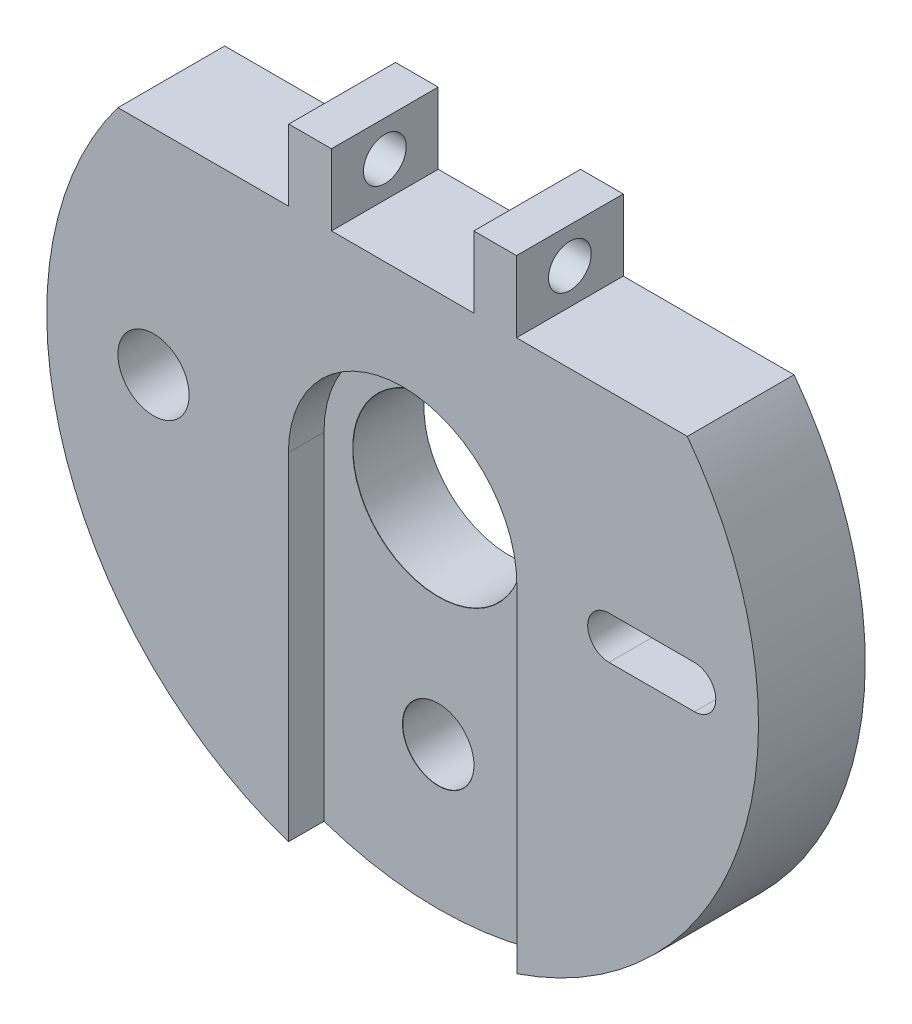
ISO-10303-21;
HEADER;
FILE_DESCRIPTION(('STEP AP214'),'2;1');
FILE_NAME('part.step','',(''),(''),'','','');
FILE_SCHEMA(('AUTOMOTIVE_DESIGN { 1 0 10303 214 1 1 1 1 }'));
ENDSEC;
DATA;
#1=APPLICATION_CONTEXT('core data for automotive mechanical design processes');
#2=APPLICATION_PROTOCOL_DEFINITION('international standard','automotive_design',2000,#1);
#3=PRODUCT_CONTEXT('',#1,'mechanical');
#4=PRODUCT('Part','Part','',(#3));
#5=PRODUCT_RELATED_PRODUCT_CATEGORY('part','',(#4));
#6=PRODUCT_DEFINITION_FORMATION('','',#4);
#7=PRODUCT_DEFINITION_CONTEXT('part definition',#1,'design');
#8=PRODUCT_DEFINITION('design','',#6,#7);
#9=PRODUCT_DEFINITION_SHAPE('','',#8);
#10=(LENGTH_UNIT() NAMED_UNIT(*) SI_UNIT(.MILLI.,.METRE.));
#11=(NAMED_UNIT(*) PLANE_ANGLE_UNIT() SI_UNIT($,.RADIAN.));
#12=(NAMED_UNIT(*) SI_UNIT($,.STERADIAN.) SOLID_ANGLE_UNIT());
#13=UNCERTAINTY_MEASURE_WITH_UNIT(LENGTH_MEASURE(1.E-05),#10,'distance_accuracy_value','');
#14=(GEOMETRIC_REPRESENTATION_CONTEXT(3) GLOBAL_UNCERTAINTY_ASSIGNED_CONTEXT((#13)) GLOBAL_UNIT_ASSIGNED_CONTEXT((#10,
#11,#12)) REPRESENTATION_CONTEXT('',''));
#15=CARTESIAN_POINT('',(0.,0.,0.));
#16=DIRECTION('',(0.,0.,1.));
#17=DIRECTION('',(1.,0.,0.));
#18=AXIS2_PLACEMENT_3D('',#15,#16,#17);
#19=CARTESIAN_POINT('',(-40.,30.,15.));
#20=DIRECTION('',(0.,1.,0.));
#21=DIRECTION('',(0.,0.,1.));
#22=AXIS2_PLACEMENT_3D('',#19,#20,#21);
#23=PLANE('',#22);
#24=DIRECTION('',(1.,0.,0.));
#25=VECTOR('',#24,1.);
#26=CARTESIAN_POINT('',(-40.,30.,0.));
#27=LINE('',#26,#25);
#28=CARTESIAN_POINT('',(-40.,30.,0.));
#29=VERTEX_POINT('',#28);
#30=CARTESIAN_POINT('',(-16.,30.,0.));
#31=VERTEX_POINT('',#30);
#32=EDGE_CURVE('E247',#29,#31,#27,.T.);
#33=ORIENTED_EDGE('',*,*,#32,.F.);
#34=DIRECTION('',(0.,0.,-1.));
#35=VECTOR('',#34,1.);
#36=CARTESIAN_POINT('',(-40.,30.,15.));
#37=LINE('',#36,#35);
#38=CARTESIAN_POINT('',(-40.,30.,15.));
#39=VERTEX_POINT('',#38);
#40=EDGE_CURVE('E321',#39,#29,#37,.T.);
#41=ORIENTED_EDGE('',*,*,#40,.F.);
#42=DIRECTION('',(1.,0.,0.));
#43=VECTOR('',#42,1.);
#44=CARTESIAN_POINT('',(-40.,30.,15.));
#45=LINE('',#44,#43);
#46=CARTESIAN_POINT('',(-16.,30.,15.));
#47=VERTEX_POINT('',#46);
#48=EDGE_CURVE('E248',#39,#47,#45,.T.);
#49=ORIENTED_EDGE('',*,*,#48,.T.);
#50=DIRECTION('',(0.,0.,-1.));
#51=VECTOR('',#50,1.);
#52=CARTESIAN_POINT('',(-16.,30.,15.));
#53=LINE('',#52,#51);
#54=EDGE_CURVE('E286',#47,#31,#53,.T.);
#55=ORIENTED_EDGE('',*,*,#54,.T.);
#56=EDGE_LOOP('',(#33,#41,#49,#55));
#57=FACE_BOUND('',#56,.T.);
#58=ADVANCED_FACE('F43',(#57),#23,.T.);
#59=CARTESIAN_POINT('',(0.,0.,15.));
#60=DIRECTION('',(0.,0.,-1.));
#61=DIRECTION('',(-1.,0.,0.));
#62=AXIS2_PLACEMENT_3D('',#59,#60,#61);
#63=CYLINDRICAL_SURFACE('',#62,50.);
#64=CARTESIAN_POINT('',(0.,0.,15.));
#65=DIRECTION('',(0.,0.,1.));
#66=DIRECTION('',(1.,0.,0.));
#67=AXIS2_PLACEMENT_3D('',#64,#65,#66);
#68=CIRCLE('',#67,50.);
#69=CARTESIAN_POINT('',(16.05,-47.3539597077161,15.));
#70=VERTEX_POINT('',#69);
#71=CARTESIAN_POINT('',(40.,30.,15.));
#72=VERTEX_POINT('',#71);
#73=EDGE_CURVE('E281',#70,#72,#68,.T.);
#74=ORIENTED_EDGE('',*,*,#73,.F.);
#75=DIRECTION('',(0.,0.,-1.));
#76=VECTOR('',#75,1.);
#77=CARTESIAN_POINT('',(16.05,-47.3539597077161,15.));
#78=LINE('',#77,#76);
#79=CARTESIAN_POINT('',(16.05,-47.3539597077161,10.));
#80=VERTEX_POINT('',#79);
#81=EDGE_CURVE('E243',#70,#80,#78,.T.);
#82=ORIENTED_EDGE('',*,*,#81,.T.);
#83=CARTESIAN_POINT('',(0.,0.,10.));
#84=DIRECTION('',(0.,0.,1.));
#85=DIRECTION('',(1.,0.,0.));
#86=AXIS2_PLACEMENT_3D('',#83,#84,#85);
#87=CIRCLE('',#86,50.);
#88=CARTESIAN_POINT('',(-16.05,-47.3539597077161,10.));
#89=VERTEX_POINT('',#88);
#90=EDGE_CURVE('E11',#89,#80,#87,.T.);
#91=ORIENTED_EDGE('',*,*,#90,.F.);
#92=DIRECTION('',(0.,0.,-1.));
#93=VECTOR('',#92,1.);
#94=CARTESIAN_POINT('',(-16.05,-47.3539597077161,15.));
#95=LINE('',#94,#93);
#96=CARTESIAN_POINT('',(-16.05,-47.3539597077161,15.));
#97=VERTEX_POINT('',#96);
#98=EDGE_CURVE('E236',#89,#97,#95,.F.);
#99=ORIENTED_EDGE('',*,*,#98,.T.);
#100=EDGE_CURVE('E282',#39,#97,#68,.T.);
#101=ORIENTED_EDGE('',*,*,#100,.F.);
#102=ORIENTED_EDGE('',*,*,#40,.T.);
#103=CARTESIAN_POINT('',(0.,0.,0.));
#104=DIRECTION('',(0.,0.,1.));
#105=DIRECTION('',(1.,0.,0.));
#106=AXIS2_PLACEMENT_3D('',#103,#104,#105);
#107=CIRCLE('',#106,50.);
#108=CARTESIAN_POINT('',(40.,30.,0.));
#109=VERTEX_POINT('',#108);
#110=EDGE_CURVE('E253',#29,#109,#107,.T.);
#111=ORIENTED_EDGE('',*,*,#110,.T.);
#112=DIRECTION('',(0.,0.,-1.));
#113=VECTOR('',#112,1.);
#114=CARTESIAN_POINT('',(40.,30.,15.));
#115=LINE('',#114,#113);
#116=EDGE_CURVE('E324',#72,#109,#115,.T.);
#117=ORIENTED_EDGE('',*,*,#116,.F.);
#118=EDGE_LOOP('',(#74,#82,#91,#99,#101,#102,#111,#117));
#119=FACE_BOUND('',#118,.T.);
#120=ADVANCED_FACE('F374',(#119),#63,.T.);
#121=CARTESIAN_POINT('',(40.,30.,15.));
#122=DIRECTION('',(0.,-1.,0.));
#123=DIRECTION('',(0.,0.,-1.));
#124=AXIS2_PLACEMENT_3D('',#121,#122,#123);
#125=PLANE('',#124);
#126=DIRECTION('',(-1.,0.,0.));
#127=VECTOR('',#126,1.);
#128=CARTESIAN_POINT('',(40.,30.,0.));
#129=LINE('',#128,#127);
#130=CARTESIAN_POINT('',(16.,30.,0.));
#131=VERTEX_POINT('',#130);
#132=EDGE_CURVE('E316',#109,#131,#129,.T.);
#133=ORIENTED_EDGE('',*,*,#132,.T.);
#134=DIRECTION('',(0.,0.,-1.));
#135=VECTOR('',#134,1.);
#136=CARTESIAN_POINT('',(16.,30.,15.));
#137=LINE('',#136,#135);
#138=CARTESIAN_POINT('',(16.,30.,15.));
#139=VERTEX_POINT('',#138);
#140=EDGE_CURVE('E328',#139,#131,#137,.T.);
#141=ORIENTED_EDGE('',*,*,#140,.F.);
#142=DIRECTION('',(-1.,0.,0.));
#143=VECTOR('',#142,1.);
#144=CARTESIAN_POINT('',(40.,30.,15.));
#145=LINE('',#144,#143);
#146=EDGE_CURVE('E278',#72,#139,#145,.T.);
#147=ORIENTED_EDGE('',*,*,#146,.F.);
#148=ORIENTED_EDGE('',*,*,#116,.T.);
#149=EDGE_LOOP('',(#133,#141,#147,#148));
#150=FACE_BOUND('',#149,.T.);
#151=ADVANCED_FACE('F395',(#150),#125,.F.);
#152=CARTESIAN_POINT('',(16.,30.,15.));
#153=DIRECTION('',(-1.,0.,0.));
#154=DIRECTION('',(0.,0.,1.));
#155=AXIS2_PLACEMENT_3D('',#152,#153,#154);
#156=PLANE('',#155);
#157=CARTESIAN_POINT('',(16.,35.,7.5));
#158=DIRECTION('',(-1.,0.,0.));
#159=DIRECTION('',(0.,0.,1.));
#160=AXIS2_PLACEMENT_3D('',#157,#158,#159);
#161=CIRCLE('',#160,3.);
#162=CARTESIAN_POINT('',(16.,35.,10.5));
#163=VERTEX_POINT('',#162);
#164=EDGE_CURVE('E739',#163,#163,#161,.T.);
#165=ORIENTED_EDGE('',*,*,#164,.T.);
#166=EDGE_LOOP('',(#165));
#167=FACE_BOUND('',#166,.T.);
#168=DIRECTION('',(0.,1.,0.));
#169=VECTOR('',#168,1.);
#170=CARTESIAN_POINT('',(16.,30.,0.));
#171=LINE('',#170,#169);
#172=CARTESIAN_POINT('',(16.,40.,0.));
#173=VERTEX_POINT('',#172);
#174=EDGE_CURVE('E313',#131,#173,#171,.T.);
#175=ORIENTED_EDGE('',*,*,#174,.T.);
#176=DIRECTION('',(0.,0.,-1.));
#177=VECTOR('',#176,1.);
#178=CARTESIAN_POINT('',(16.,40.,15.));
#179=LINE('',#178,#177);
#180=CARTESIAN_POINT('',(16.,40.,15.));
#181=VERTEX_POINT('',#180);
#182=EDGE_CURVE('E332',#181,#173,#179,.T.);
#183=ORIENTED_EDGE('',*,*,#182,.F.);
#184=DIRECTION('',(0.,1.,0.));
#185=VECTOR('',#184,1.);
#186=CARTESIAN_POINT('',(16.,30.,15.));
#187=LINE('',#186,#185);
#188=EDGE_CURVE('E275',#139,#181,#187,.T.);
#189=ORIENTED_EDGE('',*,*,#188,.F.);
#190=ORIENTED_EDGE('',*,*,#140,.T.);
#191=EDGE_LOOP('',(#175,#183,#189,#190));
#192=FACE_BOUND('',#191,.T.);
#193=ADVANCED_FACE('F412',(#167,#192),#156,.F.);
#194=CARTESIAN_POINT('',(16.,40.,15.));
#195=DIRECTION('',(0.,-1.,0.));
#196=DIRECTION('',(0.,0.,-1.));
#197=AXIS2_PLACEMENT_3D('',#194,#195,#196);
#198=PLANE('',#197);
#199=DIRECTION('',(-1.,0.,0.));
#200=VECTOR('',#199,1.);
#201=CARTESIAN_POINT('',(16.,40.,0.));
#202=LINE('',#201,#200);
#203=CARTESIAN_POINT('',(9.99999999999999,40.,0.));
#204=VERTEX_POINT('',#203);
#205=EDGE_CURVE('E310',#173,#204,#202,.T.);
#206=ORIENTED_EDGE('',*,*,#205,.T.);
#207=DIRECTION('',(0.,0.,-1.));
#208=VECTOR('',#207,1.);
#209=CARTESIAN_POINT('',(9.99999999999999,40.,15.));
#210=LINE('',#209,#208);
#211=CARTESIAN_POINT('',(9.99999999999999,40.,15.));
#212=VERTEX_POINT('',#211);
#213=EDGE_CURVE('E336',#212,#204,#210,.T.);
#214=ORIENTED_EDGE('',*,*,#213,.F.);
#215=DIRECTION('',(-1.,0.,0.));
#216=VECTOR('',#215,1.);
#217=CARTESIAN_POINT('',(16.,40.,15.));
#218=LINE('',#217,#216);
#219=EDGE_CURVE('E272',#181,#212,#218,.T.);
#220=ORIENTED_EDGE('',*,*,#219,.F.);
#221=ORIENTED_EDGE('',*,*,#182,.T.);
#222=EDGE_LOOP('',(#206,#214,#220,#221));
#223=FACE_BOUND('',#222,.T.);
#224=ADVANCED_FACE('F415',(#223),#198,.F.);
#225=CARTESIAN_POINT('',(9.99999999999999,40.,15.));
#226=DIRECTION('',(1.,0.,0.));
#227=DIRECTION('',(0.,1.,0.));
#228=AXIS2_PLACEMENT_3D('',#225,#226,#227);
#229=PLANE('',#228);
#230=CARTESIAN_POINT('',(10.,35.,7.5));
#231=DIRECTION('',(1.,0.,0.));
#232=DIRECTION('',(0.,1.,0.));
#233=AXIS2_PLACEMENT_3D('',#230,#231,#232);
#234=CIRCLE('',#233,3.);
#235=CARTESIAN_POINT('',(10.,38.,7.5));
#236=VERTEX_POINT('',#235);
#237=EDGE_CURVE('E742',#236,#236,#234,.T.);
#238=ORIENTED_EDGE('',*,*,#237,.T.);
#239=EDGE_LOOP('',(#238));
#240=FACE_BOUND('',#239,.T.);
#241=DIRECTION('',(0.,-1.,0.));
#242=VECTOR('',#241,1.);
#243=CARTESIAN_POINT('',(9.99999999999999,40.,0.));
#244=LINE('',#243,#242);
#245=CARTESIAN_POINT('',(10.,30.,0.));
#246=VERTEX_POINT('',#245);
#247=EDGE_CURVE('E306',#204,#246,#244,.T.);
#248=ORIENTED_EDGE('',*,*,#247,.T.);
#249=DIRECTION('',(0.,0.,-1.));
#250=VECTOR('',#249,1.);
#251=CARTESIAN_POINT('',(10.,30.,15.));
#252=LINE('',#251,#250);
#253=CARTESIAN_POINT('',(10.,30.,15.));
#254=VERTEX_POINT('',#253);
#255=EDGE_CURVE('E340',#254,#246,#252,.T.);
#256=ORIENTED_EDGE('',*,*,#255,.F.);
#257=DIRECTION('',(0.,-1.,0.));
#258=VECTOR('',#257,1.);
#259=CARTESIAN_POINT('',(9.99999999999999,40.,15.));
#260=LINE('',#259,#258);
#261=EDGE_CURVE('E269',#212,#254,#260,.T.);
#262=ORIENTED_EDGE('',*,*,#261,.F.);
#263=ORIENTED_EDGE('',*,*,#213,.T.);
#264=EDGE_LOOP('',(#248,#256,#262,#263));
#265=FACE_BOUND('',#264,.T.);
#266=ADVANCED_FACE('F420',(#240,#265),#229,.F.);
#267=CARTESIAN_POINT('',(-9.99999999999999,30.,15.));
#268=DIRECTION('',(0.,1.,0.));
#269=DIRECTION('',(-1.,0.,0.));
#270=AXIS2_PLACEMENT_3D('',#267,#268,#269);
#271=PLANE('',#270);
#272=DIRECTION('',(1.,0.,0.));
#273=VECTOR('',#272,1.);
#274=CARTESIAN_POINT('',(-9.99999999999999,30.,0.));
#275=LINE('',#274,#273);
#276=CARTESIAN_POINT('',(-9.99999999999999,30.,0.));
#277=VERTEX_POINT('',#276);
#278=EDGE_CURVE('E302',#277,#246,#275,.T.);
#279=ORIENTED_EDGE('',*,*,#278,.F.);
#280=DIRECTION('',(0.,0.,-1.));
#281=VECTOR('',#280,1.);
#282=CARTESIAN_POINT('',(-9.99999999999999,30.,15.));
#283=LINE('',#282,#281);
#284=CARTESIAN_POINT('',(-9.99999999999999,30.,15.));
#285=VERTEX_POINT('',#284);
#286=EDGE_CURVE('E343',#285,#277,#283,.T.);
#287=ORIENTED_EDGE('',*,*,#286,.F.);
#288=DIRECTION('',(1.,0.,0.));
#289=VECTOR('',#288,1.);
#290=CARTESIAN_POINT('',(-9.99999999999999,30.,15.));
#291=LINE('',#290,#289);
#292=EDGE_CURVE('E265',#285,#254,#291,.T.);
#293=ORIENTED_EDGE('',*,*,#292,.T.);
#294=ORIENTED_EDGE('',*,*,#255,.T.);
#295=EDGE_LOOP('',(#279,#287,#293,#294));
#296=FACE_BOUND('',#295,.T.);
#297=ADVANCED_FACE('F448',(#296),#271,.T.);
#298=CARTESIAN_POINT('',(-9.99999999999999,40.,15.));
#299=DIRECTION('',(1.,0.,0.));
#300=DIRECTION('',(0.,1.,0.));
#301=AXIS2_PLACEMENT_3D('',#298,#299,#300);
#302=PLANE('',#301);
#303=CARTESIAN_POINT('',(-9.99999999999999,35.,7.5));
#304=DIRECTION('',(1.,0.,0.));
#305=DIRECTION('',(0.,1.,0.));
#306=AXIS2_PLACEMENT_3D('',#303,#304,#305);
#307=CIRCLE('',#306,3.);
#308=CARTESIAN_POINT('',(-9.99999999999999,38.,7.5));
#309=VERTEX_POINT('',#308);
#310=EDGE_CURVE('E745',#309,#309,#307,.T.);
#311=ORIENTED_EDGE('',*,*,#310,.F.);
#312=EDGE_LOOP('',(#311));
#313=FACE_BOUND('',#312,.T.);
#314=DIRECTION('',(0.,-1.,0.));
#315=VECTOR('',#314,1.);
#316=CARTESIAN_POINT('',(-9.99999999999999,40.,0.));
#317=LINE('',#316,#315);
#318=CARTESIAN_POINT('',(-9.99999999999999,40.,0.));
#319=VERTEX_POINT('',#318);
#320=EDGE_CURVE('E298',#319,#277,#317,.T.);
#321=ORIENTED_EDGE('',*,*,#320,.F.);
#322=DIRECTION('',(0.,0.,-1.));
#323=VECTOR('',#322,1.);
#324=CARTESIAN_POINT('',(-9.99999999999999,40.,15.));
#325=LINE('',#324,#323);
#326=CARTESIAN_POINT('',(-9.99999999999999,40.,15.));
#327=VERTEX_POINT('',#326);
#328=EDGE_CURVE('E346',#327,#319,#325,.T.);
#329=ORIENTED_EDGE('',*,*,#328,.F.);
#330=DIRECTION('',(0.,-1.,0.));
#331=VECTOR('',#330,1.);
#332=CARTESIAN_POINT('',(-9.99999999999999,40.,15.));
#333=LINE('',#332,#331);
#334=EDGE_CURVE('E261',#327,#285,#333,.T.);
#335=ORIENTED_EDGE('',*,*,#334,.T.);
#336=ORIENTED_EDGE('',*,*,#286,.T.);
#337=EDGE_LOOP('',(#321,#329,#335,#336));
#338=FACE_BOUND('',#337,.T.);
#339=ADVANCED_FACE('F427',(#313,#338),#302,.T.);
#340=CARTESIAN_POINT('',(-16.,40.,15.));
#341=DIRECTION('',(0.,1.,0.));
#342=DIRECTION('',(0.,0.,1.));
#343=AXIS2_PLACEMENT_3D('',#340,#341,#342);
#344=PLANE('',#343);
#345=DIRECTION('',(1.,0.,0.));
#346=VECTOR('',#345,1.);
#347=CARTESIAN_POINT('',(-16.,40.,0.));
#348=LINE('',#347,#346);
#349=CARTESIAN_POINT('',(-16.,40.,0.));
#350=VERTEX_POINT('',#349);
#351=EDGE_CURVE('E294',#350,#319,#348,.T.);
#352=ORIENTED_EDGE('',*,*,#351,.F.);
#353=DIRECTION('',(0.,0.,-1.));
#354=VECTOR('',#353,1.);
#355=CARTESIAN_POINT('',(-16.,40.,15.));
#356=LINE('',#355,#354);
#357=CARTESIAN_POINT('',(-16.,40.,15.));
#358=VERTEX_POINT('',#357);
#359=EDGE_CURVE('E349',#358,#350,#356,.T.);
#360=ORIENTED_EDGE('',*,*,#359,.F.);
#361=DIRECTION('',(1.,0.,0.));
#362=VECTOR('',#361,1.);
#363=CARTESIAN_POINT('',(-16.,40.,15.));
#364=LINE('',#363,#362);
#365=EDGE_CURVE('E257',#358,#327,#364,.T.);
#366=ORIENTED_EDGE('',*,*,#365,.T.);
#367=ORIENTED_EDGE('',*,*,#328,.T.);
#368=EDGE_LOOP('',(#352,#360,#366,#367));
#369=FACE_BOUND('',#368,.T.);
#370=ADVANCED_FACE('F431',(#369),#344,.T.);
#371=CARTESIAN_POINT('',(-16.,30.,15.));
#372=DIRECTION('',(-1.,0.,0.));
#373=DIRECTION('',(0.,0.,1.));
#374=AXIS2_PLACEMENT_3D('',#371,#372,#373);
#375=PLANE('',#374);
#376=CARTESIAN_POINT('',(-16.,35.,7.5));
#377=DIRECTION('',(-1.,0.,0.));
#378=DIRECTION('',(0.,0.,1.));
#379=AXIS2_PLACEMENT_3D('',#376,#377,#378);
#380=CIRCLE('',#379,3.);
#381=CARTESIAN_POINT('',(-16.,35.,10.5));
#382=VERTEX_POINT('',#381);
#383=EDGE_CURVE('E814',#382,#382,#380,.T.);
#384=ORIENTED_EDGE('',*,*,#383,.F.);
#385=EDGE_LOOP('',(#384));
#386=FACE_BOUND('',#385,.T.);
#387=DIRECTION('',(0.,1.,0.));
#388=VECTOR('',#387,1.);
#389=CARTESIAN_POINT('',(-16.,30.,0.));
#390=LINE('',#389,#388);
#391=EDGE_CURVE('E290',#31,#350,#390,.T.);
#392=ORIENTED_EDGE('',*,*,#391,.F.);
#393=ORIENTED_EDGE('',*,*,#54,.F.);
#394=DIRECTION('',(0.,1.,0.));
#395=VECTOR('',#394,1.);
#396=CARTESIAN_POINT('',(-16.,30.,15.));
#397=LINE('',#396,#395);
#398=EDGE_CURVE('E252',#47,#358,#397,.T.);
#399=ORIENTED_EDGE('',*,*,#398,.T.);
#400=ORIENTED_EDGE('',*,*,#359,.T.);
#401=EDGE_LOOP('',(#392,#393,#399,#400));
#402=FACE_BOUND('',#401,.T.);
#403=ADVANCED_FACE('F434',(#386,#402),#375,.T.);
#404=CARTESIAN_POINT('',(0.,0.,15.));
#405=DIRECTION('',(0.,0.,1.));
#406=DIRECTION('',(1.,0.,0.));
#407=AXIS2_PLACEMENT_3D('',#404,#405,#406);
#408=PLANE('',#407);
#409=CARTESIAN_POINT('',(-35.,0.,15.));
#410=DIRECTION('',(0.,0.,1.));
#411=DIRECTION('',(1.,0.,0.));
#412=AXIS2_PLACEMENT_3D('',#409,#410,#411);
#413=CIRCLE('',#412,4.99999999999999);
#414=CARTESIAN_POINT('',(-30.,0.,15.));
#415=VERTEX_POINT('',#414);
#416=EDGE_CURVE('E744',#415,#415,#413,.T.);
#417=ORIENTED_EDGE('',*,*,#416,.F.);
#418=EDGE_LOOP('',(#417));
#419=FACE_BOUND('',#418,.T.);
#420=CARTESIAN_POINT('',(29.,0.,15.));
#421=DIRECTION('',(0.,0.,1.));
#422=DIRECTION('',(1.,0.,0.));
#423=AXIS2_PLACEMENT_3D('',#420,#421,#422);
#424=CIRCLE('',#423,3.);
#425=CARTESIAN_POINT('',(29.,3.,15.));
#426=VERTEX_POINT('',#425);
#427=CARTESIAN_POINT('',(29.,-3.,15.));
#428=VERTEX_POINT('',#427);
#429=EDGE_CURVE('E58',#426,#428,#424,.T.);
#430=ORIENTED_EDGE('',*,*,#429,.F.);
#431=DIRECTION('',(-1.,0.,0.));
#432=VECTOR('',#431,1.);
#433=CARTESIAN_POINT('',(29.,3.,15.));
#434=LINE('',#433,#432);
#435=CARTESIAN_POINT('',(41.,3.,15.));
#436=VERTEX_POINT('',#435);
#437=EDGE_CURVE('E176',#436,#426,#434,.T.);
#438=ORIENTED_EDGE('',*,*,#437,.F.);
#439=CARTESIAN_POINT('',(41.,0.,15.));
#440=DIRECTION('',(0.,0.,1.));
#441=DIRECTION('',(1.,0.,0.));
#442=AXIS2_PLACEMENT_3D('',#439,#440,#441);
#443=CIRCLE('',#442,3.);
#444=CARTESIAN_POINT('',(41.,-3.,15.));
#445=VERTEX_POINT('',#444);
#446=EDGE_CURVE('E201',#445,#436,#443,.T.);
#447=ORIENTED_EDGE('',*,*,#446,.F.);
#448=DIRECTION('',(1.,0.,0.));
#449=VECTOR('',#448,1.);
#450=CARTESIAN_POINT('',(29.,-3.,15.));
#451=LINE('',#450,#449);
#452=EDGE_CURVE('E194',#428,#445,#451,.T.);
#453=ORIENTED_EDGE('',*,*,#452,.F.);
#454=EDGE_LOOP('',(#430,#438,#447,#453));
#455=FACE_BOUND('',#454,.T.);
#456=DIRECTION('',(0.,1.,0.));
#457=VECTOR('',#456,1.);
#458=CARTESIAN_POINT('',(16.05,0.,15.));
#459=LINE('',#458,#457);
#460=CARTESIAN_POINT('',(16.05,0.,15.));
#461=VERTEX_POINT('',#460);
#462=EDGE_CURVE('E51',#70,#461,#459,.T.);
#463=ORIENTED_EDGE('',*,*,#462,.F.);
#464=ORIENTED_EDGE('',*,*,#73,.T.);
#465=ORIENTED_EDGE('',*,*,#146,.T.);
#466=ORIENTED_EDGE('',*,*,#188,.T.);
#467=ORIENTED_EDGE('',*,*,#219,.T.);
#468=ORIENTED_EDGE('',*,*,#261,.T.);
#469=ORIENTED_EDGE('',*,*,#292,.F.);
#470=ORIENTED_EDGE('',*,*,#334,.F.);
#471=ORIENTED_EDGE('',*,*,#365,.F.);
#472=ORIENTED_EDGE('',*,*,#398,.F.);
#473=ORIENTED_EDGE('',*,*,#48,.F.);
#474=ORIENTED_EDGE('',*,*,#100,.T.);
#475=DIRECTION('',(0.,-1.,0.));
#476=VECTOR('',#475,1.);
#477=CARTESIAN_POINT('',(-16.05,0.,15.));
#478=LINE('',#477,#476);
#479=CARTESIAN_POINT('',(-16.05,0.,15.));
#480=VERTEX_POINT('',#479);
#481=EDGE_CURVE('E220',#480,#97,#478,.T.);
#482=ORIENTED_EDGE('',*,*,#481,.F.);
#483=CARTESIAN_POINT('',(0.,0.,15.));
#484=DIRECTION('',(0.,0.,1.));
#485=DIRECTION('',(1.,0.,0.));
#486=AXIS2_PLACEMENT_3D('',#483,#484,#485);
#487=CIRCLE('',#486,16.05);
#488=EDGE_CURVE('E183',#461,#480,#487,.T.);
#489=ORIENTED_EDGE('',*,*,#488,.F.);
#490=EDGE_LOOP('',(#463,#464,#465,#466,#467,#468,#469,#470,#471,#472,#473,#474,#482,#489));
#491=FACE_BOUND('',#490,.T.);
#492=ADVANCED_FACE('F366',(#419,#455,#491),#408,.T.);
#493=CARTESIAN_POINT('',(0.,0.,0.));
#494=DIRECTION('',(0.,0.,1.));
#495=DIRECTION('',(1.,0.,0.));
#496=AXIS2_PLACEMENT_3D('',#493,#494,#495);
#497=PLANE('',#496);
#498=CARTESIAN_POINT('',(-35.,0.,0.));
#499=DIRECTION('',(0.,0.,1.));
#500=DIRECTION('',(1.,0.,0.));
#501=AXIS2_PLACEMENT_3D('',#498,#499,#500);
#502=CIRCLE('',#501,3.5);
#503=CARTESIAN_POINT('',(-31.5,0.,0.));
#504=VERTEX_POINT('',#503);
#505=EDGE_CURVE('E763',#504,#504,#502,.T.);
#506=ORIENTED_EDGE('',*,*,#505,.T.);
#507=EDGE_LOOP('',(#506));
#508=FACE_BOUND('',#507,.T.);
#509=CARTESIAN_POINT('',(0.,-30.,0.));
#510=DIRECTION('',(0.,0.,1.));
#511=DIRECTION('',(1.,0.,0.));
#512=AXIS2_PLACEMENT_3D('',#509,#510,#511);
#513=CIRCLE('',#512,5.);
#514=CARTESIAN_POINT('',(5.,-30.,0.));
#515=VERTEX_POINT('',#514);
#516=EDGE_CURVE('E775',#515,#515,#513,.T.);
#517=ORIENTED_EDGE('',*,*,#516,.T.);
#518=EDGE_LOOP('',(#517));
#519=FACE_BOUND('',#518,.T.);
#520=CARTESIAN_POINT('',(0.,0.,0.));
#521=DIRECTION('',(0.,0.,1.));
#522=DIRECTION('',(1.,0.,0.));
#523=AXIS2_PLACEMENT_3D('',#520,#521,#522);
#524=CIRCLE('',#523,12.);
#525=CARTESIAN_POINT('',(12.,0.,0.));
#526=VERTEX_POINT('',#525);
#527=EDGE_CURVE('E787',#526,#526,#524,.T.);
#528=ORIENTED_EDGE('',*,*,#527,.T.);
#529=EDGE_LOOP('',(#528));
#530=FACE_BOUND('',#529,.T.);
#531=DIRECTION('',(1.,0.,0.));
#532=VECTOR('',#531,1.);
#533=CARTESIAN_POINT('',(29.,3.,0.));
#534=LINE('',#533,#532);
#535=CARTESIAN_POINT('',(29.,3.,0.));
#536=VERTEX_POINT('',#535);
#537=CARTESIAN_POINT('',(41.,3.,0.));
#538=VERTEX_POINT('',#537);
#539=EDGE_CURVE('E189',#536,#538,#534,.T.);
#540=ORIENTED_EDGE('',*,*,#539,.F.);
#541=CARTESIAN_POINT('',(29.,0.,0.));
#542=DIRECTION('',(0.,0.,1.));
#543=DIRECTION('',(1.,0.,0.));
#544=AXIS2_PLACEMENT_3D('',#541,#542,#543);
#545=CIRCLE('',#544,3.);
#546=CARTESIAN_POINT('',(29.,-3.,0.));
#547=VERTEX_POINT('',#546);
#548=EDGE_CURVE('E169',#547,#536,#545,.F.);
#549=ORIENTED_EDGE('',*,*,#548,.F.);
#550=DIRECTION('',(-1.,0.,0.));
#551=VECTOR('',#550,1.);
#552=CARTESIAN_POINT('',(29.,-3.,0.));
#553=LINE('',#552,#551);
#554=CARTESIAN_POINT('',(41.,-3.,0.));
#555=VERTEX_POINT('',#554);
#556=EDGE_CURVE('E179',#555,#547,#553,.T.);
#557=ORIENTED_EDGE('',*,*,#556,.F.);
#558=CARTESIAN_POINT('',(41.,0.,0.));
#559=DIRECTION('',(0.,0.,1.));
#560=DIRECTION('',(1.,0.,0.));
#561=AXIS2_PLACEMENT_3D('',#558,#559,#560);
#562=CIRCLE('',#561,3.);
#563=EDGE_CURVE('E66',#538,#555,#562,.F.);
#564=ORIENTED_EDGE('',*,*,#563,.F.);
#565=EDGE_LOOP('',(#540,#549,#557,#564));
#566=FACE_BOUND('',#565,.T.);
#567=ORIENTED_EDGE('',*,*,#32,.T.);
#568=ORIENTED_EDGE('',*,*,#391,.T.);
#569=ORIENTED_EDGE('',*,*,#351,.T.);
#570=ORIENTED_EDGE('',*,*,#320,.T.);
#571=ORIENTED_EDGE('',*,*,#278,.T.);
#572=ORIENTED_EDGE('',*,*,#247,.F.);
#573=ORIENTED_EDGE('',*,*,#205,.F.);
#574=ORIENTED_EDGE('',*,*,#174,.F.);
#575=ORIENTED_EDGE('',*,*,#132,.F.);
#576=ORIENTED_EDGE('',*,*,#110,.F.);
#577=EDGE_LOOP('',(#567,#568,#569,#570,#571,#572,#573,#574,#575,#576));
#578=FACE_BOUND('',#577,.T.);
#579=ADVANCED_FACE('F186',(#508,#519,#530,#566,#578),#497,.F.);
#580=CARTESIAN_POINT('',(0.,0.,10.));
#581=DIRECTION('',(0.,0.,1.));
#582=DIRECTION('',(1.,0.,0.));
#583=AXIS2_PLACEMENT_3D('',#580,#581,#582);
#584=PLANE('',#583);
#585=CARTESIAN_POINT('',(0.,-30.,10.));
#586=DIRECTION('',(0.,0.,1.));
#587=DIRECTION('',(1.,0.,0.));
#588=AXIS2_PLACEMENT_3D('',#585,#586,#587);
#589=CIRCLE('',#588,5.025);
#590=CARTESIAN_POINT('',(5.025,-30.,10.));
#591=VERTEX_POINT('',#590);
#592=EDGE_CURVE('E767',#591,#591,#589,.T.);
#593=ORIENTED_EDGE('',*,*,#592,.F.);
#594=EDGE_LOOP('',(#593));
#595=FACE_BOUND('',#594,.T.);
#596=CARTESIAN_POINT('',(0.,0.,10.));
#597=DIRECTION('',(0.,0.,1.));
#598=DIRECTION('',(1.,0.,0.));
#599=AXIS2_PLACEMENT_3D('',#596,#597,#598);
#600=CIRCLE('',#599,12.025);
#601=CARTESIAN_POINT('',(12.025,0.,10.));
#602=VERTEX_POINT('',#601);
#603=EDGE_CURVE('E779',#602,#602,#600,.T.);
#604=ORIENTED_EDGE('',*,*,#603,.F.);
#605=EDGE_LOOP('',(#604));
#606=FACE_BOUND('',#605,.T.);
#607=ORIENTED_EDGE('',*,*,#90,.T.);
#608=DIRECTION('',(0.,1.,0.));
#609=VECTOR('',#608,1.);
#610=CARTESIAN_POINT('',(16.05,0.,10.));
#611=LINE('',#610,#609);
#612=CARTESIAN_POINT('',(16.05,0.,10.));
#613=VERTEX_POINT('',#612);
#614=EDGE_CURVE('E224',#80,#613,#611,.T.);
#615=ORIENTED_EDGE('',*,*,#614,.T.);
#616=CARTESIAN_POINT('',(0.,0.,10.));
#617=DIRECTION('',(0.,0.,1.));
#618=DIRECTION('',(1.,0.,0.));
#619=AXIS2_PLACEMENT_3D('',#616,#617,#618);
#620=CIRCLE('',#619,16.05);
#621=CARTESIAN_POINT('',(-16.05,0.,10.));
#622=VERTEX_POINT('',#621);
#623=EDGE_CURVE('E215',#613,#622,#620,.T.);
#624=ORIENTED_EDGE('',*,*,#623,.T.);
#625=DIRECTION('',(0.,-1.,0.));
#626=VECTOR('',#625,1.);
#627=CARTESIAN_POINT('',(-16.05,0.,10.));
#628=LINE('',#627,#626);
#629=EDGE_CURVE('E219',#622,#89,#628,.T.);
#630=ORIENTED_EDGE('',*,*,#629,.T.);
#631=EDGE_LOOP('',(#607,#615,#624,#630));
#632=FACE_BOUND('',#631,.T.);
#633=ADVANCED_FACE('F376',(#595,#606,#632),#584,.T.);
#634=CARTESIAN_POINT('',(16.05,0.,10.));
#635=DIRECTION('',(1.,0.,0.));
#636=DIRECTION('',(0.,0.,-1.));
#637=AXIS2_PLACEMENT_3D('',#634,#635,#636);
#638=PLANE('',#637);
#639=ORIENTED_EDGE('',*,*,#462,.T.);
#640=DIRECTION('',(0.,0.,1.));
#641=VECTOR('',#640,1.);
#642=CARTESIAN_POINT('',(16.05,0.,10.));
#643=LINE('',#642,#641);
#644=EDGE_CURVE('E232',#613,#461,#643,.T.);
#645=ORIENTED_EDGE('',*,*,#644,.F.);
#646=ORIENTED_EDGE('',*,*,#614,.F.);
#647=ORIENTED_EDGE('',*,*,#81,.F.);
#648=EDGE_LOOP('',(#639,#645,#646,#647));
#649=FACE_BOUND('',#648,.T.);
#650=ADVANCED_FACE('F357',(#649),#638,.F.);
#651=CARTESIAN_POINT('',(-16.05,0.,10.));
#652=DIRECTION('',(-1.,0.,0.));
#653=DIRECTION('',(0.,-1.,0.));
#654=AXIS2_PLACEMENT_3D('',#651,#652,#653);
#655=PLANE('',#654);
#656=ORIENTED_EDGE('',*,*,#629,.F.);
#657=DIRECTION('',(0.,0.,1.));
#658=VECTOR('',#657,1.);
#659=CARTESIAN_POINT('',(-16.05,0.,10.));
#660=LINE('',#659,#658);
#661=EDGE_CURVE('E227',#622,#480,#660,.T.);
#662=ORIENTED_EDGE('',*,*,#661,.T.);
#663=ORIENTED_EDGE('',*,*,#481,.T.);
#664=ORIENTED_EDGE('',*,*,#98,.F.);
#665=EDGE_LOOP('',(#656,#662,#663,#664));
#666=FACE_BOUND('',#665,.T.);
#667=ADVANCED_FACE('F371',(#666),#655,.F.);
#668=CARTESIAN_POINT('',(0.,0.,10.));
#669=DIRECTION('',(0.,0.,1.));
#670=DIRECTION('',(1.,0.,0.));
#671=AXIS2_PLACEMENT_3D('',#668,#669,#670);
#672=CYLINDRICAL_SURFACE('',#671,16.05);
#673=ORIENTED_EDGE('',*,*,#488,.T.);
#674=ORIENTED_EDGE('',*,*,#661,.F.);
#675=ORIENTED_EDGE('',*,*,#623,.F.);
#676=ORIENTED_EDGE('',*,*,#644,.T.);
#677=EDGE_LOOP('',(#673,#674,#675,#676));
#678=FACE_BOUND('',#677,.T.);
#679=ADVANCED_FACE('F364',(#678),#672,.F.);
#680=CARTESIAN_POINT('',(29.,0.,-0.000999999999999265));
#681=DIRECTION('',(0.,0.,1.));
#682=DIRECTION('',(1.,0.,0.));
#683=AXIS2_PLACEMENT_3D('',#680,#681,#682);
#684=CYLINDRICAL_SURFACE('',#683,3.);
#685=ORIENTED_EDGE('',*,*,#548,.T.);
#686=DIRECTION('',(0.,0.,1.));
#687=VECTOR('',#686,1.);
#688=CARTESIAN_POINT('',(29.,3.,-0.000999999999999265));
#689=LINE('',#688,#687);
#690=EDGE_CURVE('E184',#536,#426,#689,.T.);
#691=ORIENTED_EDGE('',*,*,#690,.T.);
#692=ORIENTED_EDGE('',*,*,#429,.T.);
#693=DIRECTION('',(0.,0.,1.));
#694=VECTOR('',#693,1.);
#695=CARTESIAN_POINT('',(29.,-3.,-0.000999999999999265));
#696=LINE('',#695,#694);
#697=EDGE_CURVE('E165',#547,#428,#696,.T.);
#698=ORIENTED_EDGE('',*,*,#697,.F.);
#699=EDGE_LOOP('',(#685,#691,#692,#698));
#700=FACE_BOUND('',#699,.T.);
#701=ADVANCED_FACE('F167',(#700),#684,.F.);
#702=CARTESIAN_POINT('',(29.,3.,-0.000999999999999265));
#703=DIRECTION('',(0.,1.,0.));
#704=DIRECTION('',(0.,0.,1.));
#705=AXIS2_PLACEMENT_3D('',#702,#703,#704);
#706=PLANE('',#705);
#707=ORIENTED_EDGE('',*,*,#539,.T.);
#708=DIRECTION('',(0.,0.,1.));
#709=VECTOR('',#708,1.);
#710=CARTESIAN_POINT('',(41.,3.,-0.000999999999999265));
#711=LINE('',#710,#709);
#712=EDGE_CURVE('E210',#538,#436,#711,.T.);
#713=ORIENTED_EDGE('',*,*,#712,.T.);
#714=ORIENTED_EDGE('',*,*,#437,.T.);
#715=ORIENTED_EDGE('',*,*,#690,.F.);
#716=EDGE_LOOP('',(#707,#713,#714,#715));
#717=FACE_BOUND('',#716,.T.);
#718=ADVANCED_FACE('F479',(#717),#706,.F.);
#719=CARTESIAN_POINT('',(41.,0.,-0.000999999999999265));
#720=DIRECTION('',(0.,0.,1.));
#721=DIRECTION('',(1.,0.,0.));
#722=AXIS2_PLACEMENT_3D('',#719,#720,#721);
#723=CYLINDRICAL_SURFACE('',#722,3.);
#724=ORIENTED_EDGE('',*,*,#563,.T.);
#725=DIRECTION('',(0.,0.,1.));
#726=VECTOR('',#725,1.);
#727=CARTESIAN_POINT('',(41.,-3.,-0.000999999999999265));
#728=LINE('',#727,#726);
#729=EDGE_CURVE('E175',#555,#445,#728,.T.);
#730=ORIENTED_EDGE('',*,*,#729,.T.);
#731=ORIENTED_EDGE('',*,*,#446,.T.);
#732=ORIENTED_EDGE('',*,*,#712,.F.);
#733=EDGE_LOOP('',(#724,#730,#731,#732));
#734=FACE_BOUND('',#733,.T.);
#735=ADVANCED_FACE('F485',(#734),#723,.F.);
#736=CARTESIAN_POINT('',(29.,-3.,-0.000999999999999265));
#737=DIRECTION('',(0.,-1.,0.));
#738=DIRECTION('',(0.,0.,-1.));
#739=AXIS2_PLACEMENT_3D('',#736,#737,#738);
#740=PLANE('',#739);
#741=ORIENTED_EDGE('',*,*,#556,.T.);
#742=ORIENTED_EDGE('',*,*,#697,.T.);
#743=ORIENTED_EDGE('',*,*,#452,.T.);
#744=ORIENTED_EDGE('',*,*,#729,.F.);
#745=EDGE_LOOP('',(#741,#742,#743,#744));
#746=FACE_BOUND('',#745,.T.);
#747=ADVANCED_FACE('F180',(#746),#740,.F.);
#748=CARTESIAN_POINT('',(0.,0.,10.));
#749=DIRECTION('',(0.,0.,1.));
#750=DIRECTION('',(1.,0.,0.));
#751=AXIS2_PLACEMENT_3D('',#748,#749,#750);
#752=CYLINDRICAL_SURFACE('',#751,12.);
#753=ORIENTED_EDGE('',*,*,#527,.F.);
#754=EDGE_LOOP('',(#753));
#755=FACE_BOUND('',#754,.T.);
#756=CARTESIAN_POINT('',(0.,0.,9.975));
#757=DIRECTION('',(0.,0.,1.));
#758=DIRECTION('',(1.,0.,0.));
#759=AXIS2_PLACEMENT_3D('',#756,#757,#758);
#760=CIRCLE('',#759,12.);
#761=CARTESIAN_POINT('',(12.,0.,9.975));
#762=VERTEX_POINT('',#761);
#763=EDGE_CURVE('E783',#762,#762,#760,.T.);
#764=ORIENTED_EDGE('',*,*,#763,.T.);
#765=EDGE_LOOP('',(#764));
#766=FACE_BOUND('',#765,.T.);
#767=ADVANCED_FACE('F499',(#755,#766),#752,.F.);
#768=CARTESIAN_POINT('',(0.,0.,10.));
#769=DIRECTION('',(0.,0.,1.));
#770=DIRECTION('',(1.,0.,0.));
#771=AXIS2_PLACEMENT_3D('',#768,#769,#770);
#772=CONICAL_SURFACE('',#771,12.025,0.785398163397518);
#773=ORIENTED_EDGE('',*,*,#763,.F.);
#774=EDGE_LOOP('',(#773));
#775=FACE_BOUND('',#774,.T.);
#776=ORIENTED_EDGE('',*,*,#603,.T.);
#777=EDGE_LOOP('',(#776));
#778=FACE_BOUND('',#777,.T.);
#779=ADVANCED_FACE('F506',(#775,#778),#772,.F.);
#780=CARTESIAN_POINT('',(0.,-30.,10.));
#781=DIRECTION('',(0.,0.,1.));
#782=DIRECTION('',(1.,0.,0.));
#783=AXIS2_PLACEMENT_3D('',#780,#781,#782);
#784=CYLINDRICAL_SURFACE('',#783,5.);
#785=ORIENTED_EDGE('',*,*,#516,.F.);
#786=EDGE_LOOP('',(#785));
#787=FACE_BOUND('',#786,.T.);
#788=CARTESIAN_POINT('',(0.,-30.,9.975));
#789=DIRECTION('',(0.,0.,1.));
#790=DIRECTION('',(1.,0.,0.));
#791=AXIS2_PLACEMENT_3D('',#788,#789,#790);
#792=CIRCLE('',#791,5.);
#793=CARTESIAN_POINT('',(5.,-30.,9.975));
#794=VERTEX_POINT('',#793);
#795=EDGE_CURVE('E771',#794,#794,#792,.T.);
#796=ORIENTED_EDGE('',*,*,#795,.T.);
#797=EDGE_LOOP('',(#796));
#798=FACE_BOUND('',#797,.T.);
#799=ADVANCED_FACE('F514',(#787,#798),#784,.F.);
#800=CARTESIAN_POINT('',(0.,-30.,10.));
#801=DIRECTION('',(0.,0.,1.));
#802=DIRECTION('',(1.,0.,0.));
#803=AXIS2_PLACEMENT_3D('',#800,#801,#802);
#804=CONICAL_SURFACE('',#803,5.025,0.785398163397431);
#805=ORIENTED_EDGE('',*,*,#795,.F.);
#806=EDGE_LOOP('',(#805));
#807=FACE_BOUND('',#806,.T.);
#808=ORIENTED_EDGE('',*,*,#592,.T.);
#809=EDGE_LOOP('',(#808));
#810=FACE_BOUND('',#809,.T.);
#811=ADVANCED_FACE('F522',(#807,#810),#804,.F.);
#812=CARTESIAN_POINT('',(-35.,0.,15.));
#813=DIRECTION('',(0.,0.,1.));
#814=DIRECTION('',(1.,0.,0.));
#815=AXIS2_PLACEMENT_3D('',#812,#813,#814);
#816=CYLINDRICAL_SURFACE('',#815,3.5);
#817=ORIENTED_EDGE('',*,*,#505,.F.);
#818=EDGE_LOOP('',(#817));
#819=FACE_BOUND('',#818,.T.);
#820=CARTESIAN_POINT('',(-35.,0.,5.));
#821=DIRECTION('',(0.,0.,1.));
#822=DIRECTION('',(1.,0.,0.));
#823=AXIS2_PLACEMENT_3D('',#820,#821,#822);
#824=CIRCLE('',#823,3.5);
#825=CARTESIAN_POINT('',(-31.5,0.,5.));
#826=VERTEX_POINT('',#825);
#827=EDGE_CURVE('E759',#826,#826,#824,.T.);
#828=ORIENTED_EDGE('',*,*,#827,.T.);
#829=EDGE_LOOP('',(#828));
#830=FACE_BOUND('',#829,.T.);
#831=ADVANCED_FACE('F530',(#819,#830),#816,.F.);
#832=CARTESIAN_POINT('',(-31.5,0.,5.));
#833=DIRECTION('',(0.,0.,-1.));
#834=DIRECTION('',(-1.,0.,0.));
#835=AXIS2_PLACEMENT_3D('',#832,#833,#834);
#836=PLANE('',#835);
#837=ORIENTED_EDGE('',*,*,#827,.F.);
#838=EDGE_LOOP('',(#837));
#839=FACE_BOUND('',#838,.T.);
#840=CARTESIAN_POINT('',(-35.,0.,5.));
#841=DIRECTION('',(0.,0.,1.));
#842=DIRECTION('',(1.,0.,0.));
#843=AXIS2_PLACEMENT_3D('',#840,#841,#842);
#844=CIRCLE('',#843,5.);
#845=CARTESIAN_POINT('',(-30.,0.,5.));
#846=VERTEX_POINT('',#845);
#847=EDGE_CURVE('E750',#846,#846,#844,.T.);
#848=ORIENTED_EDGE('',*,*,#847,.T.);
#849=EDGE_LOOP('',(#848));
#850=FACE_BOUND('',#849,.T.);
#851=ADVANCED_FACE('F539',(#839,#850),#836,.F.);
#852=CARTESIAN_POINT('',(-35.,0.,15.));
#853=DIRECTION('',(0.,0.,1.));
#854=DIRECTION('',(1.,0.,0.));
#855=AXIS2_PLACEMENT_3D('',#852,#853,#854);
#856=CYLINDRICAL_SURFACE('',#855,5.);
#857=ORIENTED_EDGE('',*,*,#847,.F.);
#858=EDGE_LOOP('',(#857));
#859=FACE_BOUND('',#858,.T.);
#860=ORIENTED_EDGE('',*,*,#416,.T.);
#861=EDGE_LOOP('',(#860));
#862=FACE_BOUND('',#861,.T.);
#863=ADVANCED_FACE('F548',(#859,#862),#856,.F.);
#864=CARTESIAN_POINT('',(-16.,35.,7.5));
#865=DIRECTION('',(-1.,0.,0.));
#866=DIRECTION('',(0.,0.,1.));
#867=AXIS2_PLACEMENT_3D('',#864,#865,#866);
#868=CYLINDRICAL_SURFACE('',#867,3.);
#869=ORIENTED_EDGE('',*,*,#310,.T.);
#870=EDGE_LOOP('',(#869));
#871=FACE_BOUND('',#870,.T.);
#872=ORIENTED_EDGE('',*,*,#383,.T.);
#873=EDGE_LOOP('',(#872));
#874=FACE_BOUND('',#873,.T.);
#875=ADVANCED_FACE('F556',(#871,#874),#868,.F.);
#876=ORIENTED_EDGE('',*,*,#164,.F.);
#877=EDGE_LOOP('',(#876));
#878=FACE_BOUND('',#877,.T.);
#879=ORIENTED_EDGE('',*,*,#237,.F.);
#880=EDGE_LOOP('',(#879));
#881=FACE_BOUND('',#880,.T.);
#882=ADVANCED_FACE('F565',(#878,#881),#868,.F.);
#883=CLOSED_SHELL('',(#58,#120,#151,#193,#224,#266,#297,#339,#370,#403,#492,#579,#633,#650,#667,
#679,#701,#718,#735,#747,#767,#779,#799,#811,#831,#851,#863,#875,#882));
#884=MANIFOLD_SOLID_BREP('B2',#883);
#885=ADVANCED_BREP_SHAPE_REPRESENTATION('',(#18,#884),#14);
#886=SHAPE_DEFINITION_REPRESENTATION(#9,#885);
ENDSEC;
END-ISO-10303-21;
